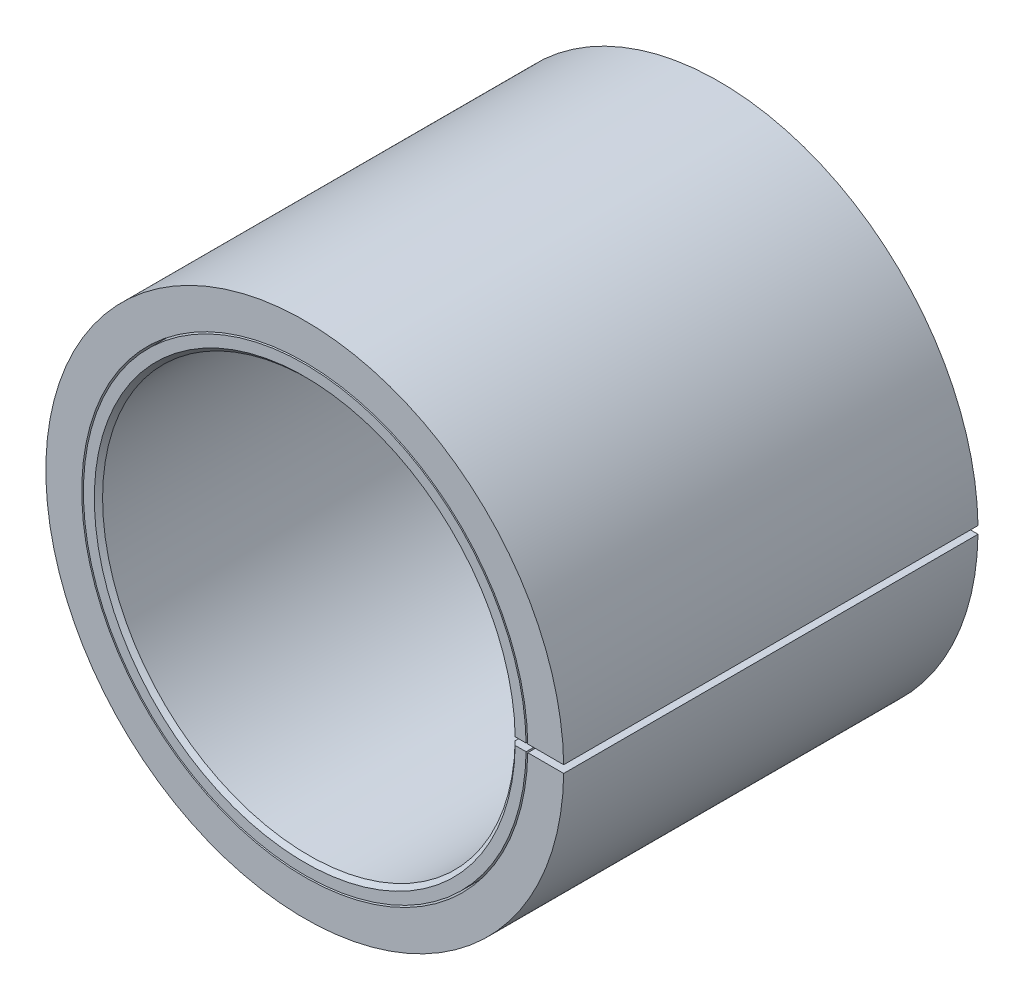
ISO-10303-21;
HEADER;
FILE_DESCRIPTION(('STEP AP214'),'2;1');
FILE_NAME('part.step','',(''),(''),'','','');
FILE_SCHEMA(('AUTOMOTIVE_DESIGN { 1 0 10303 214 1 1 1 1 }'));
ENDSEC;
DATA;
#1=APPLICATION_CONTEXT('core data for automotive mechanical design processes');
#2=APPLICATION_PROTOCOL_DEFINITION('international standard','automotive_design',2000,#1);
#3=PRODUCT_CONTEXT('',#1,'mechanical');
#4=PRODUCT('Part','Part','',(#3));
#5=PRODUCT_RELATED_PRODUCT_CATEGORY('part','',(#4));
#6=PRODUCT_DEFINITION_FORMATION('','',#4);
#7=PRODUCT_DEFINITION_CONTEXT('part definition',#1,'design');
#8=PRODUCT_DEFINITION('design','',#6,#7);
#9=PRODUCT_DEFINITION_SHAPE('','',#8);
#10=(LENGTH_UNIT() NAMED_UNIT(*) SI_UNIT(.MILLI.,.METRE.));
#11=(NAMED_UNIT(*) PLANE_ANGLE_UNIT() SI_UNIT($,.RADIAN.));
#12=(NAMED_UNIT(*) SI_UNIT($,.STERADIAN.) SOLID_ANGLE_UNIT());
#13=UNCERTAINTY_MEASURE_WITH_UNIT(LENGTH_MEASURE(1.E-05),#10,'distance_accuracy_value','');
#14=(GEOMETRIC_REPRESENTATION_CONTEXT(3) GLOBAL_UNCERTAINTY_ASSIGNED_CONTEXT((#13)) GLOBAL_UNIT_ASSIGNED_CONTEXT((#10,
#11,#12)) REPRESENTATION_CONTEXT('',''));
#15=CARTESIAN_POINT('',(0.,0.,0.));
#16=DIRECTION('',(0.,0.,1.));
#17=DIRECTION('',(1.,0.,0.));
#18=AXIS2_PLACEMENT_3D('',#15,#16,#17);
#19=CARTESIAN_POINT('',(0.,0.,-3.17499999999995));
#20=DIRECTION('',(0.,0.,1.));
#21=DIRECTION('',(1.,0.,0.));
#22=AXIS2_PLACEMENT_3D('',#19,#20,#21);
#23=CYLINDRICAL_SURFACE('',#22,3.96874999999999);
#24=DIRECTION('',(0.,0.,1.));
#25=VECTOR('',#24,1.);
#26=CARTESIAN_POINT('',(3.96833194063437,-0.05760357142585,-3.17499999999995));
#27=LINE('',#26,#25);
#28=CARTESIAN_POINT('',(3.96833194063437,-0.05760357142585,3.17499999999995));
#29=VERTEX_POINT('',#28);
#30=CARTESIAN_POINT('',(3.96833194063437,-0.05760357142585,-3.17499999999995));
#31=VERTEX_POINT('',#30);
#32=EDGE_CURVE('E104',#29,#31,#27,.F.);
#33=ORIENTED_EDGE('',*,*,#32,.F.);
#34=CARTESIAN_POINT('',(0.,0.,3.17499999999995));
#35=DIRECTION('',(0.,0.,1.));
#36=DIRECTION('',(1.,0.,0.));
#37=AXIS2_PLACEMENT_3D('',#34,#35,#36);
#38=CIRCLE('',#37,3.96874999999999);
#39=CARTESIAN_POINT('',(3.96833194063437,0.05760357142585,3.17499999999995));
#40=VERTEX_POINT('',#39);
#41=EDGE_CURVE('E131',#40,#29,#38,.T.);
#42=ORIENTED_EDGE('',*,*,#41,.F.);
#43=DIRECTION('',(0.,0.,1.));
#44=VECTOR('',#43,1.);
#45=CARTESIAN_POINT('',(3.96833194063437,0.05760357142585,-3.17499999999995));
#46=LINE('',#45,#44);
#47=CARTESIAN_POINT('',(3.96833194063437,0.05760357142585,-3.17499999999995));
#48=VERTEX_POINT('',#47);
#49=EDGE_CURVE('E127',#40,#48,#46,.F.);
#50=ORIENTED_EDGE('',*,*,#49,.T.);
#51=CARTESIAN_POINT('',(0.,0.,-3.17499999999995));
#52=DIRECTION('',(0.,0.,1.));
#53=DIRECTION('',(1.,0.,0.));
#54=AXIS2_PLACEMENT_3D('',#51,#52,#53);
#55=CIRCLE('',#54,3.96874999999999);
#56=EDGE_CURVE('E113',#48,#31,#55,.T.);
#57=ORIENTED_EDGE('',*,*,#56,.T.);
#58=EDGE_LOOP('',(#33,#42,#50,#57));
#59=FACE_BOUND('',#58,.T.);
#60=ADVANCED_FACE('F63',(#59),#23,.T.);
#61=CARTESIAN_POINT('',(0.,0.,-3.17499999999995));
#62=DIRECTION('',(0.,0.,1.));
#63=DIRECTION('',(1.,0.,0.));
#64=AXIS2_PLACEMENT_3D('',#61,#62,#63);
#65=PLANE('',#64);
#66=CARTESIAN_POINT('',(0.,0.,-3.17499999999995));
#67=DIRECTION('',(0.,0.,1.));
#68=DIRECTION('',(1.,0.,0.));
#69=AXIS2_PLACEMENT_3D('',#66,#67,#68);
#70=CIRCLE('',#69,3.41811428571429);
#71=CARTESIAN_POINT('',(3.41762887083474,0.05760357142585,-3.17499999999995));
#72=VERTEX_POINT('',#71);
#73=CARTESIAN_POINT('',(3.41762887083474,-0.05760357142585,-3.17499999999995));
#74=VERTEX_POINT('',#73);
#75=EDGE_CURVE('E122',#72,#74,#70,.T.);
#76=ORIENTED_EDGE('',*,*,#75,.T.);
#77=DIRECTION('',(1.,0.,0.));
#78=VECTOR('',#77,1.);
#79=CARTESIAN_POINT('',(0.,-0.05760357142585,-3.17499999999995));
#80=LINE('',#79,#78);
#81=EDGE_CURVE('E87',#74,#31,#80,.T.);
#82=ORIENTED_EDGE('',*,*,#81,.T.);
#83=ORIENTED_EDGE('',*,*,#56,.F.);
#84=DIRECTION('',(1.,0.,0.));
#85=VECTOR('',#84,1.);
#86=CARTESIAN_POINT('',(0.,0.05760357142585,-3.17499999999995));
#87=LINE('',#86,#85);
#88=EDGE_CURVE('E124',#72,#48,#87,.T.);
#89=ORIENTED_EDGE('',*,*,#88,.F.);
#90=EDGE_LOOP('',(#76,#82,#83,#89));
#91=FACE_BOUND('',#90,.T.);
#92=ADVANCED_FACE('F117',(#91),#65,.F.);
#93=CARTESIAN_POINT('',(0.,0.,3.17499999999995));
#94=DIRECTION('',(0.,0.,1.));
#95=DIRECTION('',(1.,0.,0.));
#96=AXIS2_PLACEMENT_3D('',#93,#94,#95);
#97=PLANE('',#96);
#98=DIRECTION('',(1.,0.,0.));
#99=VECTOR('',#98,1.);
#100=CARTESIAN_POINT('',(0.,-0.05760357142585,3.17499999999995));
#101=LINE('',#100,#99);
#102=CARTESIAN_POINT('',(3.41762887083474,-0.05760357142585,3.17499999999996));
#103=VERTEX_POINT('',#102);
#104=EDGE_CURVE('E110',#103,#29,#101,.T.);
#105=ORIENTED_EDGE('',*,*,#104,.F.);
#106=CARTESIAN_POINT('',(0.,0.,3.17499999999995));
#107=DIRECTION('',(0.,0.,1.));
#108=DIRECTION('',(1.,0.,0.));
#109=AXIS2_PLACEMENT_3D('',#106,#107,#108);
#110=CIRCLE('',#109,3.41811428571429);
#111=CARTESIAN_POINT('',(3.41762887083474,0.05760357142585,3.17499999999995));
#112=VERTEX_POINT('',#111);
#113=EDGE_CURVE('E139',#112,#103,#110,.T.);
#114=ORIENTED_EDGE('',*,*,#113,.F.);
#115=DIRECTION('',(1.,0.,0.));
#116=VECTOR('',#115,1.);
#117=CARTESIAN_POINT('',(0.,0.05760357142585,3.17499999999995));
#118=LINE('',#117,#116);
#119=EDGE_CURVE('E82',#112,#40,#118,.T.);
#120=ORIENTED_EDGE('',*,*,#119,.T.);
#121=ORIENTED_EDGE('',*,*,#41,.T.);
#122=EDGE_LOOP('',(#105,#114,#120,#121));
#123=FACE_BOUND('',#122,.T.);
#124=ADVANCED_FACE('F70',(#123),#97,.T.);
#125=CARTESIAN_POINT('',(0.,0.,-3.17499999999995));
#126=DIRECTION('',(0.,0.,1.));
#127=DIRECTION('',(1.,0.,0.));
#128=AXIS2_PLACEMENT_3D('',#125,#126,#127);
#129=CYLINDRICAL_SURFACE('',#128,3.41811428571429);
#130=ORIENTED_EDGE('',*,*,#113,.T.);
#131=DIRECTION('',(0.,0.,1.));
#132=VECTOR('',#131,1.);
#133=CARTESIAN_POINT('',(3.41762887083474,-0.05760357142585,-3.17499999999995));
#134=LINE('',#133,#132);
#135=EDGE_CURVE('E13',#103,#74,#134,.F.);
#136=ORIENTED_EDGE('',*,*,#135,.T.);
#137=ORIENTED_EDGE('',*,*,#75,.F.);
#138=DIRECTION('',(0.,0.,1.));
#139=VECTOR('',#138,1.);
#140=CARTESIAN_POINT('',(3.41762887083474,0.05760357142585,-3.17499999999995));
#141=LINE('',#140,#139);
#142=EDGE_CURVE('E75',#112,#72,#141,.F.);
#143=ORIENTED_EDGE('',*,*,#142,.F.);
#144=EDGE_LOOP('',(#130,#136,#137,#143));
#145=FACE_BOUND('',#144,.T.);
#146=ADVANCED_FACE('F150',(#145),#129,.F.);
#147=CARTESIAN_POINT('',(0.,0.05760357142585,-3.17499999999995));
#148=DIRECTION('',(0.,-1.,0.));
#149=DIRECTION('',(0.,0.,-1.));
#150=AXIS2_PLACEMENT_3D('',#147,#148,#149);
#151=PLANE('',#150);
#152=ORIENTED_EDGE('',*,*,#119,.F.);
#153=ORIENTED_EDGE('',*,*,#142,.T.);
#154=ORIENTED_EDGE('',*,*,#88,.T.);
#155=ORIENTED_EDGE('',*,*,#49,.F.);
#156=EDGE_LOOP('',(#152,#153,#154,#155));
#157=FACE_BOUND('',#156,.T.);
#158=ADVANCED_FACE('F145',(#157),#151,.T.);
#159=CARTESIAN_POINT('',(0.,-0.05760357142585,-3.17499999999995));
#160=DIRECTION('',(0.,-1.,0.));
#161=DIRECTION('',(0.,0.,-1.));
#162=AXIS2_PLACEMENT_3D('',#159,#160,#161);
#163=PLANE('',#162);
#164=ORIENTED_EDGE('',*,*,#32,.T.);
#165=ORIENTED_EDGE('',*,*,#81,.F.);
#166=ORIENTED_EDGE('',*,*,#135,.F.);
#167=ORIENTED_EDGE('',*,*,#104,.T.);
#168=EDGE_LOOP('',(#164,#165,#166,#167));
#169=FACE_BOUND('',#168,.T.);
#170=ADVANCED_FACE('F102',(#169),#163,.F.);
#171=CLOSED_SHELL('',(#60,#92,#124,#146,#158,#170));
#172=MANIFOLD_SOLID_BREP('B2',#171);
#173=CARTESIAN_POINT('',(0.,0.,-3.17499999999995));
#174=DIRECTION('',(0.,0.,1.));
#175=DIRECTION('',(1.,0.,0.));
#176=AXIS2_PLACEMENT_3D('',#173,#174,#175);
#177=PLANE('',#176);
#178=CARTESIAN_POINT('',(0.,0.,-3.17499999999995));
#179=DIRECTION('',(0.,0.,1.));
#180=DIRECTION('',(1.,0.,0.));
#181=AXIS2_PLACEMENT_3D('',#178,#179,#180);
#182=CIRCLE('',#181,3.225546);
#183=CARTESIAN_POINT('',(3.22503160088006,0.05760357142585,-3.17499999999995));
#184=VERTEX_POINT('',#183);
#185=CARTESIAN_POINT('',(3.22503160088006,-0.05760357142585,-3.17499999999995));
#186=VERTEX_POINT('',#185);
#187=EDGE_CURVE('E284',#184,#186,#182,.T.);
#188=ORIENTED_EDGE('',*,*,#187,.T.);
#189=DIRECTION('',(1.,0.,0.));
#190=VECTOR('',#189,1.);
#191=CARTESIAN_POINT('',(0.,-0.05760357142585,-3.17499999999995));
#192=LINE('',#191,#190);
#193=CARTESIAN_POINT('',(3.39222523619067,-0.05760357142585,-3.17499999999995));
#194=VERTEX_POINT('',#193);
#195=EDGE_CURVE('E235',#186,#194,#192,.T.);
#196=ORIENTED_EDGE('',*,*,#195,.T.);
#197=CARTESIAN_POINT('',(0.,0.,-3.17499999999995));
#198=DIRECTION('',(0.,0.,1.));
#199=DIRECTION('',(1.,0.,0.));
#200=AXIS2_PLACEMENT_3D('',#197,#198,#199);
#201=CIRCLE('',#200,3.39271428571429);
#202=CARTESIAN_POINT('',(3.39222523619067,0.05760357142585,-3.17499999999995));
#203=VERTEX_POINT('',#202);
#204=EDGE_CURVE('E283',#203,#194,#201,.T.);
#205=ORIENTED_EDGE('',*,*,#204,.F.);
#206=DIRECTION('',(1.,0.,0.));
#207=VECTOR('',#206,1.);
#208=CARTESIAN_POINT('',(0.,0.05760357142585,-3.17499999999995));
#209=LINE('',#208,#207);
#210=EDGE_CURVE('E290',#184,#203,#209,.T.);
#211=ORIENTED_EDGE('',*,*,#210,.F.);
#212=EDGE_LOOP('',(#188,#196,#205,#211));
#213=FACE_BOUND('',#212,.T.);
#214=ADVANCED_FACE('F214',(#213),#177,.F.);
#215=CARTESIAN_POINT('',(0.,0.,-3.17499999999995));
#216=DIRECTION('',(0.,0.,1.));
#217=DIRECTION('',(1.,0.,0.));
#218=AXIS2_PLACEMENT_3D('',#215,#216,#217);
#219=CYLINDRICAL_SURFACE('',#218,3.16230000000001);
#220=CARTESIAN_POINT('',(0.,0.,3.11175399999995));
#221=DIRECTION('',(0.,0.,1.));
#222=DIRECTION('',(1.,0.,0.));
#223=AXIS2_PLACEMENT_3D('',#220,#221,#222);
#224=CIRCLE('',#223,3.16230000000001);
#225=CARTESIAN_POINT('',(3.16177531120714,0.05760357142585,3.11175399999995));
#226=VERTEX_POINT('',#225);
#227=CARTESIAN_POINT('',(3.16177531120714,-0.05760357142585,3.11175399999995));
#228=VERTEX_POINT('',#227);
#229=EDGE_CURVE('E297',#226,#228,#224,.T.);
#230=ORIENTED_EDGE('',*,*,#229,.T.);
#231=DIRECTION('',(0.,0.,1.));
#232=VECTOR('',#231,1.);
#233=CARTESIAN_POINT('',(3.16177531120714,-0.05760357142585,-3.17499999999995));
#234=LINE('',#233,#232);
#235=CARTESIAN_POINT('',(3.16177531120714,-0.05760357142585,-3.11175399999996));
#236=VERTEX_POINT('',#235);
#237=EDGE_CURVE('E366',#228,#236,#234,.F.);
#238=ORIENTED_EDGE('',*,*,#237,.T.);
#239=CARTESIAN_POINT('',(0.,0.,-3.11175399999996));
#240=DIRECTION('',(0.,0.,1.));
#241=DIRECTION('',(1.,0.,0.));
#242=AXIS2_PLACEMENT_3D('',#239,#240,#241);
#243=CIRCLE('',#242,3.16230000000001);
#244=CARTESIAN_POINT('',(3.16177531120714,0.05760357142585,-3.11175399999996));
#245=VERTEX_POINT('',#244);
#246=EDGE_CURVE('E291',#236,#245,#243,.F.);
#247=ORIENTED_EDGE('',*,*,#246,.T.);
#248=DIRECTION('',(0.,0.,1.));
#249=VECTOR('',#248,1.);
#250=CARTESIAN_POINT('',(3.16177531120714,0.05760357142585,-3.17499999999995));
#251=LINE('',#250,#249);
#252=EDGE_CURVE('E239',#226,#245,#251,.F.);
#253=ORIENTED_EDGE('',*,*,#252,.F.);
#254=EDGE_LOOP('',(#230,#238,#247,#253));
#255=FACE_BOUND('',#254,.T.);
#256=ADVANCED_FACE('F389',(#255),#219,.F.);
#257=CARTESIAN_POINT('',(0.,0.,3.17499999999995));
#258=DIRECTION('',(0.,0.,1.));
#259=DIRECTION('',(1.,0.,0.));
#260=AXIS2_PLACEMENT_3D('',#257,#258,#259);
#261=PLANE('',#260);
#262=DIRECTION('',(1.,0.,0.));
#263=VECTOR('',#262,1.);
#264=CARTESIAN_POINT('',(0.,-0.05760357142585,3.17499999999995));
#265=LINE('',#264,#263);
#266=CARTESIAN_POINT('',(3.22503460261453,-0.0576034910609265,3.17500299982051));
#267=VERTEX_POINT('',#266);
#268=CARTESIAN_POINT('',(3.39222523619067,-0.05760357142585,3.17499999999996));
#269=VERTEX_POINT('',#268);
#270=EDGE_CURVE('E272',#267,#269,#265,.T.);
#271=ORIENTED_EDGE('',*,*,#270,.F.);
#272=CARTESIAN_POINT('',(0.,0.,3.17499999999995));
#273=DIRECTION('',(0.,0.,1.));
#274=DIRECTION('',(1.,0.,0.));
#275=AXIS2_PLACEMENT_3D('',#272,#273,#274);
#276=CIRCLE('',#275,3.22554600000001);
#277=CARTESIAN_POINT('',(3.22503460261453,0.0576034910609265,3.17500299982051));
#278=VERTEX_POINT('',#277);
#279=EDGE_CURVE('E309',#267,#278,#276,.F.);
#280=ORIENTED_EDGE('',*,*,#279,.T.);
#281=DIRECTION('',(1.,0.,0.));
#282=VECTOR('',#281,1.);
#283=CARTESIAN_POINT('',(0.,0.05760357142585,3.17499999999995));
#284=LINE('',#283,#282);
#285=CARTESIAN_POINT('',(3.39222523619067,0.05760357142585,3.17499999999996));
#286=VERTEX_POINT('',#285);
#287=EDGE_CURVE('E369',#278,#286,#284,.T.);
#288=ORIENTED_EDGE('',*,*,#287,.T.);
#289=CARTESIAN_POINT('',(0.,0.,3.17499999999995));
#290=DIRECTION('',(0.,0.,1.));
#291=DIRECTION('',(1.,0.,0.));
#292=AXIS2_PLACEMENT_3D('',#289,#290,#291);
#293=CIRCLE('',#292,3.39271428571429);
#294=EDGE_CURVE('E295',#286,#269,#293,.T.);
#295=ORIENTED_EDGE('',*,*,#294,.T.);
#296=EDGE_LOOP('',(#271,#280,#288,#295));
#297=FACE_BOUND('',#296,.T.);
#298=ADVANCED_FACE('F393',(#297),#261,.T.);
#299=CARTESIAN_POINT('',(0.,0.,-3.17499999999995));
#300=DIRECTION('',(0.,0.,1.));
#301=DIRECTION('',(1.,0.,0.));
#302=AXIS2_PLACEMENT_3D('',#299,#300,#301);
#303=CYLINDRICAL_SURFACE('',#302,3.39271428571429);
#304=DIRECTION('',(0.,0.,1.));
#305=VECTOR('',#304,1.);
#306=CARTESIAN_POINT('',(3.39222523619067,-0.05760357142585,-3.17499999999995));
#307=LINE('',#306,#305);
#308=EDGE_CURVE('E267',#269,#194,#307,.F.);
#309=ORIENTED_EDGE('',*,*,#308,.F.);
#310=ORIENTED_EDGE('',*,*,#294,.F.);
#311=DIRECTION('',(0.,0.,1.));
#312=VECTOR('',#311,1.);
#313=CARTESIAN_POINT('',(3.39222523619067,0.05760357142585,-3.17499999999995));
#314=LINE('',#313,#312);
#315=EDGE_CURVE('E293',#286,#203,#314,.F.);
#316=ORIENTED_EDGE('',*,*,#315,.T.);
#317=ORIENTED_EDGE('',*,*,#204,.T.);
#318=EDGE_LOOP('',(#309,#310,#316,#317));
#319=FACE_BOUND('',#318,.T.);
#320=ADVANCED_FACE('F289',(#319),#303,.T.);
#321=CARTESIAN_POINT('',(0.,0.,3.11175399999995));
#322=DIRECTION('',(0.,0.,1.));
#323=DIRECTION('',(1.,0.,0.));
#324=AXIS2_PLACEMENT_3D('',#321,#322,#323);
#325=CONICAL_SURFACE('',#324,3.16230000000001,0.785398163397462);
#326=CARTESIAN_POINT('',(-3.22636599923688,-0.05760357142585,3.17633418563944));
#327=CARTESIAN_POINT('',(-3.00352246481999,-0.05760357142585,2.95352713459118));
#328=CARTESIAN_POINT('',(-2.78067667437134,-0.05760357142585,2.73072236222287));
#329=CARTESIAN_POINT('',(-2.33496864498516,-0.05760357142585,2.28512805674046));
#330=CARTESIAN_POINT('',(-2.11210640600449,-0.05760357142585,2.06233852366951));
#331=CARTESIAN_POINT('',(-1.66646677907694,-0.05760357142585,1.61689856448044));
#332=CARTESIAN_POINT('',(-1.44368940478357,-0.05760357142585,1.39424812472721));
#333=CARTESIAN_POINT('',(-1.10942869473695,-0.05760357142585,1.06036764246654));
#334=CARTESIAN_POINT('',(-0.997992763911138,-0.05760357142585,0.949090091715494));
#335=CARTESIAN_POINT('',(-0.775053192920879,-0.05760357142585,0.726602827964723));
#336=CARTESIAN_POINT('',(-0.663549552822943,-0.05760357142585,0.615393114898581));
#337=CARTESIAN_POINT('',(-0.521277605862709,-0.05760357142585,0.473896472671456));
#338=CARTESIAN_POINT('',(-0.490654341528874,-0.05760357142585,0.443463665775829));
#339=CARTESIAN_POINT('',(-0.429358955449896,-0.05760357142585,0.382642884882062));
#340=CARTESIAN_POINT('',(-0.398686830492628,-0.05760357142585,0.352254914107745));
#341=CARTESIAN_POINT('',(-0.326880021622122,-0.05760357142585,0.281306928480259));
#342=CARTESIAN_POINT('',(-0.285712782937419,-0.05760357142585,0.240780086944241));
#343=CARTESIAN_POINT('',(-0.216632568746271,-0.05760357142585,0.173511434891045));
#344=CARTESIAN_POINT('',(-0.188841898182179,-0.05760357142585,0.146646141118947));
#345=CARTESIAN_POINT('',(-0.151267100644223,-0.05760357142585,0.111290393661551));
#346=CARTESIAN_POINT('',(-0.141800790806334,-0.05760357142585,0.102463409431536));
#347=CARTESIAN_POINT('',(-0.122733110051039,-0.05760357142585,0.0849768618541004));
#348=CARTESIAN_POINT('',(-0.113131908340204,-0.05760357142585,0.0763171163652447));
#349=CARTESIAN_POINT('',(-0.097251662554268,-0.05760357142585,0.0624464010284464));
#350=CARTESIAN_POINT('',(-0.0910542093881101,-0.05760357142585,0.0571420759751377));
#351=CARTESIAN_POINT('',(-0.0784609106501065,-0.05760357142585,0.0467246015011113));
#352=CARTESIAN_POINT('',(-0.0720644691206615,-0.05760357142585,0.0416121533390017));
#353=CARTESIAN_POINT('',(-0.0589222842135124,-0.05760357142585,0.0317384119083851));
#354=CARTESIAN_POINT('',(-0.0521740114811343,-0.05760357142585,0.0269805138259713));
#355=CARTESIAN_POINT('',(-0.0381361608485922,-0.05760357142585,0.0183126616239258));
#356=CARTESIAN_POINT('',(-0.030849631918983,-0.05760357142585,0.0143983594242227));
#357=CARTESIAN_POINT('',(-0.0192219550465625,-0.05760357142585,0.010074750123798));
#358=CARTESIAN_POINT('',(-0.0151894406358417,-0.05760357142585,0.00888800780940673));
#359=CARTESIAN_POINT('',(-0.00698541297842049,-0.05760357142585,0.00734179957442073));
#360=CARTESIAN_POINT('',(-0.00281509723356076,-0.05760357142585,0.00697648956761739));
#361=CARTESIAN_POINT('',(0.0055159262545862,-0.05760357142585,0.0071703054658729));
#362=CARTESIAN_POINT('',(0.0096765542652963,-0.05760357142585,0.00773255066606121));
#363=CARTESIAN_POINT('',(0.0178376043858602,-0.05760357142585,0.00962252608472961));
#364=CARTESIAN_POINT('',(0.0218366102039767,-0.05760357142585,0.01095590011129));
#365=CARTESIAN_POINT('',(0.0303367290934457,-0.05760357142585,0.014420579904552));
#366=CARTESIAN_POINT('',(0.0347942753511198,-0.05760357142585,0.0166537403252446));
#367=CARTESIAN_POINT('',(0.04347961385035,-0.05760357142585,0.0215363031995108));
#368=CARTESIAN_POINT('',(0.0477068104726428,-0.05760357142585,0.0241867216461434));
#369=CARTESIAN_POINT('',(0.0601902391466345,-0.05760357142585,0.0325312194583105));
#370=CARTESIAN_POINT('',(0.0681964917361911,-0.05760357142585,0.0385920448271347));
#371=CARTESIAN_POINT('',(0.0850802329380415,-0.05760357142585,0.0520611432663263));
#372=CARTESIAN_POINT('',(0.0939037839030866,-0.05760357142585,0.0595337562710646));
#373=CARTESIAN_POINT('',(0.11133085669634,-0.05760357142585,0.0747334221054491));
#374=CARTESIAN_POINT('',(0.119934349176875,-0.05760357142585,0.0824605085613494));
#375=CARTESIAN_POINT('',(0.145586320569029,-0.05760357142585,0.105861519554562));
#376=CARTESIAN_POINT('',(0.16245170677704,-0.05760357142585,0.121734126934861));
#377=CARTESIAN_POINT('',(0.19590748306883,-0.05760357142585,0.153596471387113));
#378=CARTESIAN_POINT('',(0.212498830761278,-0.05760357142585,0.169585214840777));
#379=CARTESIAN_POINT('',(0.245568614314511,-0.05760357142585,0.2016557911711));
#380=CARTESIAN_POINT('',(0.262047121825295,-0.05760357142585,0.217737550093421));
#381=CARTESIAN_POINT('',(0.311350592074538,-0.05760357142585,0.26601738181362));
#382=CARTESIAN_POINT('',(0.344093867723211,-0.05760357142585,0.298298665096573));
#383=CARTESIAN_POINT('',(0.40949216841844,-0.05760357142585,0.36295085917554));
#384=CARTESIAN_POINT('',(0.442147192712113,-0.05760357142585,0.395321770731445));
#385=CARTESIAN_POINT('',(0.540063092718573,-0.05760357142585,0.492520799993731));
#386=CARTESIAN_POINT('',(0.605256357093012,-0.05760357142585,0.557417010345319));
#387=CARTESIAN_POINT('',(0.73567495642177,-0.05760357142585,0.687362262699998));
#388=CARTESIAN_POINT('',(0.800900205389976,-0.05760357142585,0.752411390852781));
#389=CARTESIAN_POINT('',(0.93131239940782,-0.05760357142585,0.882536123062767));
#390=CARTESIAN_POINT('',(0.99649934741497,-0.05760357142585,0.947611724154585));
#391=CARTESIAN_POINT('',(1.32228182297785,-0.05760357142585,1.27291024582715));
#392=CARTESIAN_POINT('',(1.58276860237631,-0.05760357142585,1.53324203676468));
#393=CARTESIAN_POINT('',(2.10371559003493,-0.05760357142585,2.05394989868113));
#394=CARTESIAN_POINT('',(2.36417579708967,-0.05760357142585,2.31432597086515));
#395=CARTESIAN_POINT('',(2.88490821061857,-0.05760357142585,2.83493017073962));
#396=CARTESIAN_POINT('',(3.1451804299905,-0.05760357142585,3.09515828552542));
#397=CARTESIAN_POINT('',(3.66571514307746,-0.05760357142585,3.61561958940128));
#398=CARTESIAN_POINT('',(3.9259776368586,-0.05760357142585,3.87585277842521));
#399=CARTESIAN_POINT('',(4.56371752124501,-0.05760357142585,4.51353179186651));
#400=CARTESIAN_POINT('',(4.94119244903606,-0.05760357142585,4.89098007951628));
#401=CARTESIAN_POINT('',(5.6963299493485,-0.05760357142585,5.64607416247294));
#402=CARTESIAN_POINT('',(6.07399251935053,-0.05760357142585,6.02371996029933));
#403=CARTESIAN_POINT('',(6.45165484774698,-0.05760357142585,6.40136599923683));
#404=B_SPLINE_CURVE_WITH_KNOTS('',3,(#326,#327,#328,#329,#330,#331,#332,#333,#334,#335,#336,
#337,#338,#339,#340,#341,#342,#343,#344,#345,#346,#347,#348,#349,#350,#351,#352,#353,#354,#355,
#356,#357,#358,#359,#360,#361,#362,#363,#364,#365,#366,#367,#368,#369,#370,#371,#372,#373,#374,
#375,#376,#377,#378,#379,#380,#381,#382,#383,#384,#385,#386,#387,#388,#389,#390,#391,#392,#393,
#394,#395,#396,#397,#398,#399,#400,#401,#402,#403),.UNSPECIFIED.,.F.,.F.,(4,2,2,2,2,2,2,2,2,2,2,
2,2,2,2,2,2,2,2,2,2,2,2,2,2,2,2,2,2,2,2,2,2,2,2,2,2,2,4),(0.,0.945367624287078,1.89073782289373,
2.8356328570747,3.3080796908231,3.78052606125673,3.9100462174065,4.03957527203391,
4.21288116083788,4.32883342202994,4.36766251039754,4.40644660701426,4.43091774546635,
4.45547100171832,4.48023525588599,4.50486864369472,4.51741774258005,4.52987727446746,
4.54237879225283,4.55497298650496,4.56989182406727,4.58484756636832,4.61493225755715,
4.6496164435886,4.68430523134279,4.75377987878601,4.8229043501855,4.89197986208062,
5.0299208068685,5.16786292475569,5.44382488787863,5.72017884430743,5.99650752708032,
7.1013305592598,8.20619117733678,9.31033912572989,10.4144772088204,12.0159111842155,
13.6181621905619),.UNSPECIFIED.);
#405=EDGE_CURVE('E280',#228,#267,#404,.T.);
#406=ORIENTED_EDGE('',*,*,#405,.F.);
#407=ORIENTED_EDGE('',*,*,#229,.F.);
#408=CARTESIAN_POINT('',(-3.22636599923688,0.05760357142585,3.17633418563944));
#409=CARTESIAN_POINT('',(-3.00352246481999,0.05760357142585,2.95352713459118));
#410=CARTESIAN_POINT('',(-2.78067667437134,0.05760357142585,2.73072236222287));
#411=CARTESIAN_POINT('',(-2.33496864498516,0.05760357142585,2.28512805674046));
#412=CARTESIAN_POINT('',(-2.11210640600449,0.05760357142585,2.06233852366951));
#413=CARTESIAN_POINT('',(-1.66646677907694,0.05760357142585,1.61689856448044));
#414=CARTESIAN_POINT('',(-1.44368940478357,0.05760357142585,1.39424812472721));
#415=CARTESIAN_POINT('',(-1.10942869473695,0.05760357142585,1.06036764246654));
#416=CARTESIAN_POINT('',(-0.997992763911138,0.05760357142585,0.949090091715494));
#417=CARTESIAN_POINT('',(-0.775053192920879,0.05760357142585,0.726602827964723));
#418=CARTESIAN_POINT('',(-0.663549552822943,0.05760357142585,0.615393114898581));
#419=CARTESIAN_POINT('',(-0.521277605862709,0.05760357142585,0.473896472671456));
#420=CARTESIAN_POINT('',(-0.490654341528874,0.05760357142585,0.443463665775829));
#421=CARTESIAN_POINT('',(-0.429358955449896,0.05760357142585,0.382642884882062));
#422=CARTESIAN_POINT('',(-0.398686830492628,0.05760357142585,0.352254914107745));
#423=CARTESIAN_POINT('',(-0.326880021622122,0.05760357142585,0.281306928480259));
#424=CARTESIAN_POINT('',(-0.285712782937419,0.05760357142585,0.240780086944241));
#425=CARTESIAN_POINT('',(-0.216632568746271,0.05760357142585,0.173511434891045));
#426=CARTESIAN_POINT('',(-0.188841898182179,0.05760357142585,0.146646141118947));
#427=CARTESIAN_POINT('',(-0.151267100644223,0.05760357142585,0.111290393661551));
#428=CARTESIAN_POINT('',(-0.141800790806334,0.05760357142585,0.102463409431536));
#429=CARTESIAN_POINT('',(-0.122733110051039,0.05760357142585,0.0849768618541004));
#430=CARTESIAN_POINT('',(-0.113131908340204,0.05760357142585,0.0763171163652447));
#431=CARTESIAN_POINT('',(-0.097251662554268,0.05760357142585,0.0624464010284464));
#432=CARTESIAN_POINT('',(-0.0910542093881101,0.05760357142585,0.0571420759751377));
#433=CARTESIAN_POINT('',(-0.0784609106501065,0.05760357142585,0.0467246015011113));
#434=CARTESIAN_POINT('',(-0.0720644691206615,0.05760357142585,0.0416121533390017));
#435=CARTESIAN_POINT('',(-0.0589222842135124,0.05760357142585,0.0317384119083851));
#436=CARTESIAN_POINT('',(-0.0521740114811343,0.05760357142585,0.0269805138259713));
#437=CARTESIAN_POINT('',(-0.0381361608485922,0.05760357142585,0.0183126616239258));
#438=CARTESIAN_POINT('',(-0.030849631918983,0.05760357142585,0.0143983594242227));
#439=CARTESIAN_POINT('',(-0.0192219550465625,0.05760357142585,0.010074750123798));
#440=CARTESIAN_POINT('',(-0.0151894406358417,0.05760357142585,0.00888800780940673));
#441=CARTESIAN_POINT('',(-0.00698541297842049,0.05760357142585,0.00734179957442073));
#442=CARTESIAN_POINT('',(-0.00281509723356076,0.05760357142585,0.00697648956761739));
#443=CARTESIAN_POINT('',(0.0055159262545862,0.05760357142585,0.0071703054658729));
#444=CARTESIAN_POINT('',(0.0096765542652963,0.05760357142585,0.00773255066606121));
#445=CARTESIAN_POINT('',(0.0178376043858602,0.05760357142585,0.00962252608472961));
#446=CARTESIAN_POINT('',(0.0218366102039767,0.05760357142585,0.01095590011129));
#447=CARTESIAN_POINT('',(0.0303367290934457,0.05760357142585,0.014420579904552));
#448=CARTESIAN_POINT('',(0.0347942753511198,0.05760357142585,0.0166537403252446));
#449=CARTESIAN_POINT('',(0.04347961385035,0.05760357142585,0.0215363031995108));
#450=CARTESIAN_POINT('',(0.0477068104726428,0.05760357142585,0.0241867216461434));
#451=CARTESIAN_POINT('',(0.0601902391466345,0.05760357142585,0.0325312194583105));
#452=CARTESIAN_POINT('',(0.0681964917361911,0.05760357142585,0.0385920448271347));
#453=CARTESIAN_POINT('',(0.0850802329380415,0.05760357142585,0.0520611432663263));
#454=CARTESIAN_POINT('',(0.0939037839030866,0.05760357142585,0.0595337562710646));
#455=CARTESIAN_POINT('',(0.11133085669634,0.05760357142585,0.0747334221054491));
#456=CARTESIAN_POINT('',(0.119934349176875,0.05760357142585,0.0824605085613494));
#457=CARTESIAN_POINT('',(0.145586320569029,0.05760357142585,0.105861519554562));
#458=CARTESIAN_POINT('',(0.16245170677704,0.05760357142585,0.121734126934861));
#459=CARTESIAN_POINT('',(0.19590748306883,0.05760357142585,0.153596471387113));
#460=CARTESIAN_POINT('',(0.212498830761278,0.05760357142585,0.169585214840777));
#461=CARTESIAN_POINT('',(0.245568614314511,0.05760357142585,0.2016557911711));
#462=CARTESIAN_POINT('',(0.262047121825295,0.05760357142585,0.217737550093421));
#463=CARTESIAN_POINT('',(0.311350592074538,0.05760357142585,0.26601738181362));
#464=CARTESIAN_POINT('',(0.344093867723211,0.05760357142585,0.298298665096573));
#465=CARTESIAN_POINT('',(0.40949216841844,0.05760357142585,0.36295085917554));
#466=CARTESIAN_POINT('',(0.442147192712113,0.05760357142585,0.395321770731445));
#467=CARTESIAN_POINT('',(0.540063092718573,0.05760357142585,0.492520799993731));
#468=CARTESIAN_POINT('',(0.605256357093012,0.05760357142585,0.557417010345319));
#469=CARTESIAN_POINT('',(0.73567495642177,0.05760357142585,0.687362262699998));
#470=CARTESIAN_POINT('',(0.800900205389976,0.05760357142585,0.752411390852781));
#471=CARTESIAN_POINT('',(0.93131239940782,0.05760357142585,0.882536123062767));
#472=CARTESIAN_POINT('',(0.99649934741497,0.05760357142585,0.947611724154585));
#473=CARTESIAN_POINT('',(1.32228182297785,0.05760357142585,1.27291024582715));
#474=CARTESIAN_POINT('',(1.58276860237631,0.05760357142585,1.53324203676468));
#475=CARTESIAN_POINT('',(2.10371559003493,0.05760357142585,2.05394989868113));
#476=CARTESIAN_POINT('',(2.36417579708967,0.05760357142585,2.31432597086515));
#477=CARTESIAN_POINT('',(2.88490821061857,0.05760357142585,2.83493017073962));
#478=CARTESIAN_POINT('',(3.1451804299905,0.05760357142585,3.09515828552542));
#479=CARTESIAN_POINT('',(3.66571514307746,0.05760357142585,3.61561958940128));
#480=CARTESIAN_POINT('',(3.9259776368586,0.05760357142585,3.87585277842521));
#481=CARTESIAN_POINT('',(4.56371752124501,0.05760357142585,4.51353179186651));
#482=CARTESIAN_POINT('',(4.94119244903606,0.05760357142585,4.89098007951628));
#483=CARTESIAN_POINT('',(5.6963299493485,0.05760357142585,5.64607416247294));
#484=CARTESIAN_POINT('',(6.07399251935053,0.05760357142585,6.02371996029933));
#485=CARTESIAN_POINT('',(6.45165484774698,0.05760357142585,6.40136599923683));
#486=B_SPLINE_CURVE_WITH_KNOTS('',3,(#408,#409,#410,#411,#412,#413,#414,#415,#416,#417,#418,
#419,#420,#421,#422,#423,#424,#425,#426,#427,#428,#429,#430,#431,#432,#433,#434,#435,#436,#437,
#438,#439,#440,#441,#442,#443,#444,#445,#446,#447,#448,#449,#450,#451,#452,#453,#454,#455,#456,
#457,#458,#459,#460,#461,#462,#463,#464,#465,#466,#467,#468,#469,#470,#471,#472,#473,#474,#475,
#476,#477,#478,#479,#480,#481,#482,#483,#484,#485),.UNSPECIFIED.,.F.,.F.,(4,2,2,2,2,2,2,2,2,2,2,
2,2,2,2,2,2,2,2,2,2,2,2,2,2,2,2,2,2,2,2,2,2,2,2,2,2,2,4),(0.,0.945367624287078,1.89073782289373,
2.8356328570747,3.3080796908231,3.78052606125673,3.9100462174065,4.03957527203391,
4.21288116083788,4.32883342202994,4.36766251039754,4.40644660701426,4.43091774546635,
4.45547100171832,4.48023525588599,4.50486864369472,4.51741774258005,4.52987727446746,
4.54237879225283,4.55497298650496,4.56989182406727,4.58484756636832,4.61493225755715,
4.6496164435886,4.68430523134279,4.75377987878601,4.8229043501855,4.89197986208062,
5.0299208068685,5.16786292475569,5.44382488787863,5.72017884430743,5.99650752708032,
7.1013305592598,8.20619117733678,9.31033912572989,10.4144772088204,12.0159111842155,
13.6181621905619),.UNSPECIFIED.);
#487=EDGE_CURVE('E336',#226,#278,#486,.T.);
#488=ORIENTED_EDGE('',*,*,#487,.T.);
#489=ORIENTED_EDGE('',*,*,#279,.F.);
#490=EDGE_LOOP('',(#406,#407,#488,#489));
#491=FACE_BOUND('',#490,.T.);
#492=ADVANCED_FACE('F345',(#491),#325,.F.);
#493=CARTESIAN_POINT('',(0.,0.,-3.17499999999995));
#494=DIRECTION('',(0.,0.,-1.));
#495=DIRECTION('',(-1.,0.,0.));
#496=AXIS2_PLACEMENT_3D('',#493,#494,#495);
#497=CONICAL_SURFACE('',#496,3.225546,0.785398163397445);
#498=CARTESIAN_POINT('',(6.45165484774685,-0.05760357142585,-6.40136599923682));
#499=CARTESIAN_POINT('',(6.0062360796644,-0.05760357142585,-5.95596571479158));
#500=CARTESIAN_POINT('',(5.56081635548887,-0.05760357142585,-5.51056637582005));
#501=CARTESIAN_POINT('',(4.66996869790597,-0.05760357142585,-4.61977532110211));
#502=CARTESIAN_POINT('',(4.22454076449339,-0.05760357142585,-4.1743836053609));
#503=CARTESIAN_POINT('',(3.33366717960185,-0.05760357142585,-3.28361031802734));
#504=CARTESIAN_POINT('',(2.88822152800419,-0.05760357142585,-2.83822874655387));
#505=CARTESIAN_POINT('',(2.22000683551005,-0.05760357142585,-2.17020286822475));
#506=CARTESIAN_POINT('',(1.9972609818466,-0.05760357142585,-1.94753540156813));
#507=CARTESIAN_POINT('',(1.55173338701935,-0.05760357142585,-1.50223639700247));
#508=CARTESIAN_POINT('',(1.32895164584788,-0.05760357142585,-1.27960485910112));
#509=CARTESIAN_POINT('',(0.983888926454314,-0.05760357142585,-0.935006214349324));
#510=CARTESIAN_POINT('',(0.861660285845727,-0.05760357142585,-0.812986888454726));
#511=CARTESIAN_POINT('',(0.657529333174979,-0.05760357142585,-0.609470081506297));
#512=CARTESIAN_POINT('',(0.575670691408087,-0.05760357142585,-0.527928620536799));
#513=CARTESIAN_POINT('',(0.438858240083253,-0.05760357142585,-0.392026172135903));
#514=CARTESIAN_POINT('',(0.383967484215211,-0.05760357142585,-0.337602249783905));
#515=CARTESIAN_POINT('',(0.292057725089467,-0.05760357142585,-0.247070250208081));
#516=CARTESIAN_POINT('',(0.255136775754963,-0.05760357142585,-0.210862097041745));
#517=CARTESIAN_POINT('',(0.193098165247573,-0.05760357142585,-0.150846154623634));
#518=CARTESIAN_POINT('',(0.168117466682644,-0.05760357142585,-0.126899706581279));
#519=CARTESIAN_POINT('',(0.134243572674892,-0.05760357142585,-0.095504104624103));
#520=CARTESIAN_POINT('',(0.125702445364263,-0.05760357142585,-0.0876768063616266));
#521=CARTESIAN_POINT('',(0.108460813772685,-0.05760357142585,-0.0722007661408789));
#522=CARTESIAN_POINT('',(0.0997603458234129,-0.05760357142585,-0.064551984361378));
#523=CARTESIAN_POINT('',(0.0842146934383626,-0.05760357142585,-0.0514228875562716));
#524=CARTESIAN_POINT('',(0.0774328649740816,-0.05760357142585,-0.0458675726046799));
#525=CARTESIAN_POINT('',(0.0635680695040886,-0.05760357142585,-0.0351226854959535));
#526=CARTESIAN_POINT('',(0.0564849882540025,-0.05760357142585,-0.0299332541121069));
#527=CARTESIAN_POINT('',(0.0448260126766707,-0.05760357142585,-0.0223723354772373));
#528=CARTESIAN_POINT('',(0.0404315539271403,-0.05760357142585,-0.0197260505941111));
#529=CARTESIAN_POINT('',(0.0313719644107911,-0.05760357142585,-0.0149333047853135));
#530=CARTESIAN_POINT('',(0.0267073077119689,-0.05760357142585,-0.0127859997007024));
#531=CARTESIAN_POINT('',(0.0185142411762376,-0.05760357142585,-0.00987870524628942));
#532=CARTESIAN_POINT('',(0.0150681362341072,-0.05760357142585,-0.00889558847873495));
#533=CARTESIAN_POINT('',(0.00806514065338114,-0.05760357142585,-0.00751914942716872));
#534=CARTESIAN_POINT('',(0.00450867499167046,-0.05760357142585,-0.00712379647884626));
#535=CARTESIAN_POINT('',(-0.00263335179239375,-0.05760357142585,-0.00700660746641327));
#536=CARTESIAN_POINT('',(-0.00621897049891035,-0.05760357142585,-0.00728803093315523));
#537=CARTESIAN_POINT('',(-0.0132903999664686,-0.05760357142585,-0.00846730874329642));
#538=CARTESIAN_POINT('',(-0.0167759178500132,-0.05760357142585,-0.00936681123421297));
#539=CARTESIAN_POINT('',(-0.0272811757167679,-0.05760357142585,-0.0128333306297852));
#540=CARTESIAN_POINT('',(-0.034039258663798,-0.05760357142585,-0.0161511725135852));
#541=CARTESIAN_POINT('',(-0.0470751358714794,-0.05760357142585,-0.0236547760086106));
#542=CARTESIAN_POINT('',(-0.0533476645006927,-0.05760357142585,-0.0278486060749444));
#543=CARTESIAN_POINT('',(-0.0661284509588461,-0.05760357142585,-0.0370327097807751));
#544=CARTESIAN_POINT('',(-0.0726097157677877,-0.05760357142585,-0.0420605328326083));
#545=CARTESIAN_POINT('',(-0.0853677079620475,-0.05760357142585,-0.0523712560907806));
#546=CARTESIAN_POINT('',(-0.0916442828111145,-0.05760357142585,-0.0576543395579186));
#547=CARTESIAN_POINT('',(-0.110309570631528,-0.05760357142585,-0.0737341162792503));
#548=CARTESIAN_POINT('',(-0.122513063416136,-0.05760357142585,-0.0847450288528834));
#549=CARTESIAN_POINT('',(-0.146666276862861,-0.05760357142585,-0.10696015986397));
#550=CARTESIAN_POINT('',(-0.15861668154819,-0.05760357142585,-0.118163651592376));
#551=CARTESIAN_POINT('',(-0.182386955306903,-0.05760357142585,-0.140683460764234));
#552=CARTESIAN_POINT('',(-0.194206949964152,-0.05760357142585,-0.151999645187642));
#553=CARTESIAN_POINT('',(-0.229457533617172,-0.05760357142585,-0.185945642245688));
#554=CARTESIAN_POINT('',(-0.252789644246837,-0.05760357142585,-0.208677250900256));
#555=CARTESIAN_POINT('',(-0.29934281976292,-0.05760357142585,-0.254254634742906));
#556=CARTESIAN_POINT('',(-0.322563881926385,-0.05760357142585,-0.277100412702659));
#557=CARTESIAN_POINT('',(-0.392160337209237,-0.05760357142585,-0.3457457620506));
#558=CARTESIAN_POINT('',(-0.438448693038693,-0.05760357142585,-0.391633522299944));
#559=CARTESIAN_POINT('',(-0.530944690530492,-0.05760357142585,-0.483489729500142));
#560=CARTESIAN_POINT('',(-0.577152332498788,-0.05760357142585,-0.529458176143816));
#561=CARTESIAN_POINT('',(-0.669517610168718,-0.05760357142585,-0.621431705313833));
#562=CARTESIAN_POINT('',(-0.71567525223645,-0.05760357142585,-0.667436781442522));
#563=CARTESIAN_POINT('',(-0.946394768370212,-0.05760357142585,-0.897492105990083));
#564=CARTESIAN_POINT('',(-1.1308089680947,-0.05760357142585,-1.08169035984089));
#565=CARTESIAN_POINT('',(-1.49959799876249,-0.05760357142585,-1.45014633265488));
#566=CARTESIAN_POINT('',(-1.68397282700701,-0.05760357142585,-1.63440405431537));
#567=CARTESIAN_POINT('',(-2.05268287134181,-0.05760357142585,-2.00293523245064));
#568=CARTESIAN_POINT('',(-2.23701808922558,-0.05760357142585,-2.18720868713));
#569=CARTESIAN_POINT('',(-2.60567608004838,-0.05760357142585,-2.55576367070088));
#570=CARTESIAN_POINT('',(-2.78999885310899,-0.05760357142585,-2.74004519947084));
#571=CARTESIAN_POINT('',(-3.01632638654216,-0.05760357142585,-2.9663302534264));
#572=CARTESIAN_POINT('',(-3.05833429810629,-0.05760357142585,-3.00833062586441));
#573=CARTESIAN_POINT('',(-3.14235018033263,-0.05760357142585,-3.09233201995277));
#574=CARTESIAN_POINT('',(-3.18435815099236,-0.05760357142585,-3.13433304160562));
#575=CARTESIAN_POINT('',(-3.22636599923687,-0.05760357142585,-3.17633418563944));
#576=B_SPLINE_CURVE_WITH_KNOTS('',3,(#498,#499,#500,#501,#502,#503,#504,#505,#506,#507,#508,
#509,#510,#511,#512,#513,#514,#515,#516,#517,#518,#519,#520,#521,#522,#523,#524,#525,#526,#527,
#528,#529,#530,#531,#532,#533,#534,#535,#536,#537,#538,#539,#540,#541,#542,#543,#544,#545,#546,
#547,#548,#549,#550,#551,#552,#553,#554,#555,#556,#557,#558,#559,#560,#561,#562,#563,#564,#565,
#566,#567,#568,#569,#570,#571,#572,#573,#574,#575),.UNSPECIFIED.,.F.,.F.,(4,2,2,2,2,2,2,2,2,2,2,
2,2,2,2,2,2,2,2,2,2,2,2,2,2,2,2,2,2,2,2,2,2,2,2,2,2,2,4),(0.,1.88971259398204,3.77942643221464,
5.66915638449224,6.61402068467751,7.55888518731407,8.07701320057232,8.42363837842234,
8.65553013331192,8.81066925963281,8.9144726239401,8.94922756480997,8.98397467741532,
9.01027186309905,9.03657911199741,9.05195299922104,9.06730068487058,9.07801322250403,
9.08868866269475,9.09941562146428,9.11017129593321,9.13257829550758,9.1552015782489,
9.17979373925139,9.20440382610731,9.25370316199692,9.30284560438923,9.3519356549429,
9.44965892389908,9.54738457690703,9.7429210220659,9.93845672440838,10.1339636095446,
10.9159087140395,11.697896505787,12.4798335835162,13.2617613949656,13.4399698775254,
13.6181798625304),.UNSPECIFIED.);
#577=EDGE_CURVE('E64',#186,#236,#576,.T.);
#578=ORIENTED_EDGE('',*,*,#577,.F.);
#579=ORIENTED_EDGE('',*,*,#187,.F.);
#580=CARTESIAN_POINT('',(6.45165484774685,0.05760357142585,-6.40136599923682));
#581=CARTESIAN_POINT('',(6.0062360796644,0.05760357142585,-5.95596571479158));
#582=CARTESIAN_POINT('',(5.56081635548887,0.05760357142585,-5.51056637582005));
#583=CARTESIAN_POINT('',(4.66996869790597,0.05760357142585,-4.61977532110211));
#584=CARTESIAN_POINT('',(4.22454076449339,0.05760357142585,-4.1743836053609));
#585=CARTESIAN_POINT('',(3.33366717960185,0.05760357142585,-3.28361031802734));
#586=CARTESIAN_POINT('',(2.88822152800419,0.05760357142585,-2.83822874655387));
#587=CARTESIAN_POINT('',(2.22000683551005,0.05760357142585,-2.17020286822475));
#588=CARTESIAN_POINT('',(1.9972609818466,0.05760357142585,-1.94753540156813));
#589=CARTESIAN_POINT('',(1.55173338701935,0.05760357142585,-1.50223639700247));
#590=CARTESIAN_POINT('',(1.32895164584788,0.05760357142585,-1.27960485910112));
#591=CARTESIAN_POINT('',(0.983888926454314,0.05760357142585,-0.935006214349324));
#592=CARTESIAN_POINT('',(0.861660285845727,0.05760357142585,-0.812986888454726));
#593=CARTESIAN_POINT('',(0.657529333174979,0.05760357142585,-0.609470081506297));
#594=CARTESIAN_POINT('',(0.575670691408087,0.05760357142585,-0.527928620536799));
#595=CARTESIAN_POINT('',(0.438858240083253,0.05760357142585,-0.392026172135903));
#596=CARTESIAN_POINT('',(0.383967484215211,0.05760357142585,-0.337602249783905));
#597=CARTESIAN_POINT('',(0.292057725089467,0.05760357142585,-0.247070250208081));
#598=CARTESIAN_POINT('',(0.255136775754963,0.05760357142585,-0.210862097041745));
#599=CARTESIAN_POINT('',(0.193098165247573,0.05760357142585,-0.150846154623634));
#600=CARTESIAN_POINT('',(0.168117466682644,0.05760357142585,-0.126899706581279));
#601=CARTESIAN_POINT('',(0.134243572674892,0.05760357142585,-0.095504104624103));
#602=CARTESIAN_POINT('',(0.125702445364263,0.05760357142585,-0.0876768063616266));
#603=CARTESIAN_POINT('',(0.108460813772685,0.05760357142585,-0.0722007661408789));
#604=CARTESIAN_POINT('',(0.0997603458234129,0.05760357142585,-0.064551984361378));
#605=CARTESIAN_POINT('',(0.0842146934383626,0.05760357142585,-0.0514228875562716));
#606=CARTESIAN_POINT('',(0.0774328649740816,0.05760357142585,-0.0458675726046799));
#607=CARTESIAN_POINT('',(0.0635680695040886,0.05760357142585,-0.0351226854959535));
#608=CARTESIAN_POINT('',(0.0564849882540025,0.05760357142585,-0.0299332541121069));
#609=CARTESIAN_POINT('',(0.0448260126766707,0.05760357142585,-0.0223723354772373));
#610=CARTESIAN_POINT('',(0.0404315539271403,0.05760357142585,-0.0197260505941111));
#611=CARTESIAN_POINT('',(0.0313719644107911,0.05760357142585,-0.0149333047853135));
#612=CARTESIAN_POINT('',(0.0267073077119689,0.05760357142585,-0.0127859997007024));
#613=CARTESIAN_POINT('',(0.0185142411762376,0.05760357142585,-0.00987870524628942));
#614=CARTESIAN_POINT('',(0.0150681362341072,0.05760357142585,-0.00889558847873495));
#615=CARTESIAN_POINT('',(0.00806514065338114,0.05760357142585,-0.00751914942716872));
#616=CARTESIAN_POINT('',(0.00450867499167046,0.05760357142585,-0.00712379647884626));
#617=CARTESIAN_POINT('',(-0.00263335179239375,0.05760357142585,-0.00700660746641327));
#618=CARTESIAN_POINT('',(-0.00621897049891035,0.05760357142585,-0.00728803093315523));
#619=CARTESIAN_POINT('',(-0.0132903999664686,0.05760357142585,-0.00846730874329642));
#620=CARTESIAN_POINT('',(-0.0167759178500132,0.05760357142585,-0.00936681123421297));
#621=CARTESIAN_POINT('',(-0.0272811757167679,0.05760357142585,-0.0128333306297852));
#622=CARTESIAN_POINT('',(-0.034039258663798,0.05760357142585,-0.0161511725135852));
#623=CARTESIAN_POINT('',(-0.0470751358714794,0.05760357142585,-0.0236547760086106));
#624=CARTESIAN_POINT('',(-0.0533476645006927,0.05760357142585,-0.0278486060749444));
#625=CARTESIAN_POINT('',(-0.0661284509588461,0.05760357142585,-0.0370327097807751));
#626=CARTESIAN_POINT('',(-0.0726097157677877,0.05760357142585,-0.0420605328326083));
#627=CARTESIAN_POINT('',(-0.0853677079620475,0.05760357142585,-0.0523712560907806));
#628=CARTESIAN_POINT('',(-0.0916442828111145,0.05760357142585,-0.0576543395579186));
#629=CARTESIAN_POINT('',(-0.110309570631528,0.05760357142585,-0.0737341162792503));
#630=CARTESIAN_POINT('',(-0.122513063416136,0.05760357142585,-0.0847450288528834));
#631=CARTESIAN_POINT('',(-0.146666276862861,0.05760357142585,-0.10696015986397));
#632=CARTESIAN_POINT('',(-0.15861668154819,0.05760357142585,-0.118163651592376));
#633=CARTESIAN_POINT('',(-0.182386955306903,0.05760357142585,-0.140683460764234));
#634=CARTESIAN_POINT('',(-0.194206949964152,0.05760357142585,-0.151999645187642));
#635=CARTESIAN_POINT('',(-0.229457533617172,0.05760357142585,-0.185945642245688));
#636=CARTESIAN_POINT('',(-0.252789644246837,0.05760357142585,-0.208677250900256));
#637=CARTESIAN_POINT('',(-0.29934281976292,0.05760357142585,-0.254254634742906));
#638=CARTESIAN_POINT('',(-0.322563881926385,0.05760357142585,-0.277100412702659));
#639=CARTESIAN_POINT('',(-0.392160337209237,0.05760357142585,-0.3457457620506));
#640=CARTESIAN_POINT('',(-0.438448693038693,0.05760357142585,-0.391633522299944));
#641=CARTESIAN_POINT('',(-0.530944690530492,0.05760357142585,-0.483489729500142));
#642=CARTESIAN_POINT('',(-0.577152332498788,0.05760357142585,-0.529458176143816));
#643=CARTESIAN_POINT('',(-0.669517610168718,0.05760357142585,-0.621431705313833));
#644=CARTESIAN_POINT('',(-0.71567525223645,0.05760357142585,-0.667436781442522));
#645=CARTESIAN_POINT('',(-0.946394768370212,0.05760357142585,-0.897492105990083));
#646=CARTESIAN_POINT('',(-1.1308089680947,0.05760357142585,-1.08169035984089));
#647=CARTESIAN_POINT('',(-1.49959799876249,0.05760357142585,-1.45014633265488));
#648=CARTESIAN_POINT('',(-1.68397282700701,0.05760357142585,-1.63440405431537));
#649=CARTESIAN_POINT('',(-2.05268287134181,0.05760357142585,-2.00293523245064));
#650=CARTESIAN_POINT('',(-2.23701808922558,0.05760357142585,-2.18720868713));
#651=CARTESIAN_POINT('',(-2.60567608004838,0.05760357142585,-2.55576367070088));
#652=CARTESIAN_POINT('',(-2.78999885310899,0.05760357142585,-2.74004519947084));
#653=CARTESIAN_POINT('',(-3.01632638654216,0.05760357142585,-2.9663302534264));
#654=CARTESIAN_POINT('',(-3.05833429810629,0.05760357142585,-3.00833062586441));
#655=CARTESIAN_POINT('',(-3.14235018033263,0.05760357142585,-3.09233201995277));
#656=CARTESIAN_POINT('',(-3.18435815099236,0.05760357142585,-3.13433304160562));
#657=CARTESIAN_POINT('',(-3.22636599923687,0.05760357142585,-3.17633418563944));
#658=B_SPLINE_CURVE_WITH_KNOTS('',3,(#580,#581,#582,#583,#584,#585,#586,#587,#588,#589,#590,
#591,#592,#593,#594,#595,#596,#597,#598,#599,#600,#601,#602,#603,#604,#605,#606,#607,#608,#609,
#610,#611,#612,#613,#614,#615,#616,#617,#618,#619,#620,#621,#622,#623,#624,#625,#626,#627,#628,
#629,#630,#631,#632,#633,#634,#635,#636,#637,#638,#639,#640,#641,#642,#643,#644,#645,#646,#647,
#648,#649,#650,#651,#652,#653,#654,#655,#656,#657),.UNSPECIFIED.,.F.,.F.,(4,2,2,2,2,2,2,2,2,2,2,
2,2,2,2,2,2,2,2,2,2,2,2,2,2,2,2,2,2,2,2,2,2,2,2,2,2,2,4),(0.,1.88971259398204,3.77942643221464,
5.66915638449224,6.61402068467751,7.55888518731407,8.07701320057232,8.42363837842234,
8.65553013331192,8.81066925963281,8.9144726239401,8.94922756480997,8.98397467741532,
9.01027186309905,9.03657911199741,9.05195299922104,9.06730068487058,9.07801322250403,
9.08868866269475,9.09941562146428,9.11017129593321,9.13257829550758,9.1552015782489,
9.17979373925139,9.20440382610731,9.25370316199692,9.30284560438923,9.3519356549429,
9.44965892389908,9.54738457690703,9.7429210220659,9.93845672440838,10.1339636095446,
10.9159087140395,11.697896505787,12.4798335835162,13.2617613949656,13.4399698775254,
13.6181798625304),.UNSPECIFIED.);
#659=EDGE_CURVE('E224',#184,#245,#658,.T.);
#660=ORIENTED_EDGE('',*,*,#659,.T.);
#661=ORIENTED_EDGE('',*,*,#246,.F.);
#662=EDGE_LOOP('',(#578,#579,#660,#661));
#663=FACE_BOUND('',#662,.T.);
#664=ADVANCED_FACE('F216',(#663),#497,.F.);
#665=CARTESIAN_POINT('',(0.,0.05760357142585,-3.17499999999995));
#666=DIRECTION('',(0.,-1.,0.));
#667=DIRECTION('',(0.,0.,-1.));
#668=AXIS2_PLACEMENT_3D('',#665,#666,#667);
#669=PLANE('',#668);
#670=ORIENTED_EDGE('',*,*,#487,.F.);
#671=ORIENTED_EDGE('',*,*,#252,.T.);
#672=ORIENTED_EDGE('',*,*,#659,.F.);
#673=ORIENTED_EDGE('',*,*,#210,.T.);
#674=ORIENTED_EDGE('',*,*,#315,.F.);
#675=ORIENTED_EDGE('',*,*,#287,.F.);
#676=EDGE_LOOP('',(#670,#671,#672,#673,#674,#675));
#677=FACE_BOUND('',#676,.T.);
#678=ADVANCED_FACE('F321',(#677),#669,.T.);
#679=CARTESIAN_POINT('',(0.,-0.05760357142585,-3.17499999999995));
#680=DIRECTION('',(0.,-1.,0.));
#681=DIRECTION('',(0.,0.,-1.));
#682=AXIS2_PLACEMENT_3D('',#679,#680,#681);
#683=PLANE('',#682);
#684=ORIENTED_EDGE('',*,*,#270,.T.);
#685=ORIENTED_EDGE('',*,*,#308,.T.);
#686=ORIENTED_EDGE('',*,*,#195,.F.);
#687=ORIENTED_EDGE('',*,*,#577,.T.);
#688=ORIENTED_EDGE('',*,*,#237,.F.);
#689=ORIENTED_EDGE('',*,*,#405,.T.);
#690=EDGE_LOOP('',(#684,#685,#686,#687,#688,#689));
#691=FACE_BOUND('',#690,.T.);
#692=ADVANCED_FACE('F270',(#691),#683,.F.);
#693=CLOSED_SHELL('',(#214,#256,#298,#320,#492,#664,#678,#692));
#694=MANIFOLD_SOLID_BREP('B7',#693);
#695=ADVANCED_BREP_SHAPE_REPRESENTATION('',(#18,#172,#694),#14);
#696=SHAPE_DEFINITION_REPRESENTATION(#9,#695);
ENDSEC;
END-ISO-10303-21;
